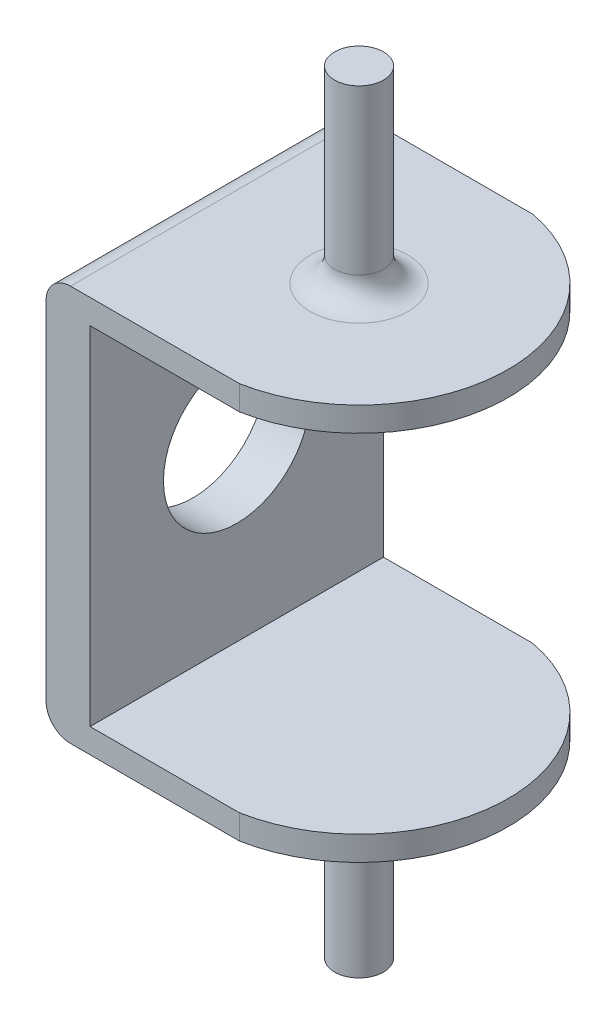
ISO-10303-21;
HEADER;
FILE_DESCRIPTION(('STEP AP214'),'2;1');
FILE_NAME('part.step','',(''),(''),'','','');
FILE_SCHEMA(('AUTOMOTIVE_DESIGN { 1 0 10303 214 1 1 1 1 }'));
ENDSEC;
DATA;
#1=APPLICATION_CONTEXT('core data for automotive mechanical design processes');
#2=APPLICATION_PROTOCOL_DEFINITION('international standard','automotive_design',2000,#1);
#3=PRODUCT_CONTEXT('',#1,'mechanical');
#4=PRODUCT('Part','Part','',(#3));
#5=PRODUCT_RELATED_PRODUCT_CATEGORY('part','',(#4));
#6=PRODUCT_DEFINITION_FORMATION('','',#4);
#7=PRODUCT_DEFINITION_CONTEXT('part definition',#1,'design');
#8=PRODUCT_DEFINITION('design','',#6,#7);
#9=PRODUCT_DEFINITION_SHAPE('','',#8);
#10=(LENGTH_UNIT() NAMED_UNIT(*) SI_UNIT(.MILLI.,.METRE.));
#11=(NAMED_UNIT(*) PLANE_ANGLE_UNIT() SI_UNIT($,.RADIAN.));
#12=(NAMED_UNIT(*) SI_UNIT($,.STERADIAN.) SOLID_ANGLE_UNIT());
#13=UNCERTAINTY_MEASURE_WITH_UNIT(LENGTH_MEASURE(1.E-05),#10,'distance_accuracy_value','');
#14=(GEOMETRIC_REPRESENTATION_CONTEXT(3) GLOBAL_UNCERTAINTY_ASSIGNED_CONTEXT((#13)) GLOBAL_UNIT_ASSIGNED_CONTEXT((#10,
#11,#12)) REPRESENTATION_CONTEXT('',''));
#15=CARTESIAN_POINT('',(0.,0.,0.));
#16=DIRECTION('',(0.,0.,1.));
#17=DIRECTION('',(1.,0.,0.));
#18=AXIS2_PLACEMENT_3D('',#15,#16,#17);
#19=CARTESIAN_POINT('',(11.0124386918829,70.05,-60.));
#20=DIRECTION('',(0.,0.,1.));
#21=DIRECTION('',(1.,0.,0.));
#22=AXIS2_PLACEMENT_3D('',#19,#20,#21);
#23=PLANE('',#22);
#24=DIRECTION('',(0.,1.,0.));
#25=VECTOR('',#24,1.);
#26=CARTESIAN_POINT('',(-68.,-81.95,-60.));
#27=LINE('',#26,#25);
#28=CARTESIAN_POINT('',(-68.,-71.95,-60.));
#29=VERTEX_POINT('',#28);
#30=CARTESIAN_POINT('',(-68.,70.05,-60.));
#31=VERTEX_POINT('',#30);
#32=EDGE_CURVE('E141',#29,#31,#27,.T.);
#33=ORIENTED_EDGE('',*,*,#32,.T.);
#34=CARTESIAN_POINT('',(-58.,70.05,-60.));
#35=DIRECTION('',(0.,0.,1.));
#36=DIRECTION('',(1.,0.,0.));
#37=AXIS2_PLACEMENT_3D('',#34,#35,#36);
#38=CIRCLE('',#37,10.);
#39=CARTESIAN_POINT('',(-58.,80.05,-60.));
#40=VERTEX_POINT('',#39);
#41=EDGE_CURVE('E202',#31,#40,#38,.F.);
#42=ORIENTED_EDGE('',*,*,#41,.T.);
#43=DIRECTION('',(1.,0.,0.));
#44=VECTOR('',#43,1.);
#45=CARTESIAN_POINT('',(11.0124386918829,80.05,-60.));
#46=LINE('',#45,#44);
#47=CARTESIAN_POINT('',(11.0124386918829,80.05,-60.));
#48=VERTEX_POINT('',#47);
#49=EDGE_CURVE('E172',#40,#48,#46,.T.);
#50=ORIENTED_EDGE('',*,*,#49,.T.);
#51=DIRECTION('',(0.,1.,0.));
#52=VECTOR('',#51,1.);
#53=CARTESIAN_POINT('',(11.0124386918829,70.05,-60.));
#54=LINE('',#53,#52);
#55=CARTESIAN_POINT('',(11.0124386918829,70.05,-60.));
#56=VERTEX_POINT('',#55);
#57=EDGE_CURVE('E186',#56,#48,#54,.T.);
#58=ORIENTED_EDGE('',*,*,#57,.F.);
#59=DIRECTION('',(1.,0.,0.));
#60=VECTOR('',#59,1.);
#61=CARTESIAN_POINT('',(-11.0124386918829,70.05,-60.));
#62=LINE('',#61,#60);
#63=CARTESIAN_POINT('',(-50.,70.05,-60.));
#64=VERTEX_POINT('',#63);
#65=EDGE_CURVE('E150',#64,#56,#62,.T.);
#66=ORIENTED_EDGE('',*,*,#65,.F.);
#67=DIRECTION('',(0.,-1.,0.));
#68=VECTOR('',#67,1.);
#69=CARTESIAN_POINT('',(-50.,-71.95,-60.));
#70=LINE('',#69,#68);
#71=CARTESIAN_POINT('',(-50.,-71.95,-60.));
#72=VERTEX_POINT('',#71);
#73=EDGE_CURVE('E133',#64,#72,#70,.T.);
#74=ORIENTED_EDGE('',*,*,#73,.T.);
#75=DIRECTION('',(1.,0.,0.));
#76=VECTOR('',#75,1.);
#77=CARTESIAN_POINT('',(11.0124386918829,-71.95,-60.));
#78=LINE('',#77,#76);
#79=CARTESIAN_POINT('',(11.0124386918829,-71.95,-60.));
#80=VERTEX_POINT('',#79);
#81=EDGE_CURVE('E147',#72,#80,#78,.T.);
#82=ORIENTED_EDGE('',*,*,#81,.T.);
#83=DIRECTION('',(0.,-1.,0.));
#84=VECTOR('',#83,1.);
#85=CARTESIAN_POINT('',(11.0124386918829,-71.95,-60.));
#86=LINE('',#85,#84);
#87=CARTESIAN_POINT('',(11.0124386918829,-81.95,-60.));
#88=VERTEX_POINT('',#87);
#89=EDGE_CURVE('E156',#80,#88,#86,.T.);
#90=ORIENTED_EDGE('',*,*,#89,.T.);
#91=DIRECTION('',(1.,0.,0.));
#92=VECTOR('',#91,1.);
#93=CARTESIAN_POINT('',(-11.0124386918829,-81.95,-60.));
#94=LINE('',#93,#92);
#95=CARTESIAN_POINT('',(-58.,-81.95,-60.));
#96=VERTEX_POINT('',#95);
#97=EDGE_CURVE('E169',#96,#88,#94,.T.);
#98=ORIENTED_EDGE('',*,*,#97,.F.);
#99=CARTESIAN_POINT('',(-58.,-71.95,-60.));
#100=DIRECTION('',(0.,0.,1.));
#101=DIRECTION('',(1.,0.,0.));
#102=AXIS2_PLACEMENT_3D('',#99,#100,#101);
#103=CIRCLE('',#102,10.);
#104=EDGE_CURVE('E200',#96,#29,#103,.F.);
#105=ORIENTED_EDGE('',*,*,#104,.T.);
#106=EDGE_LOOP('',(#33,#42,#50,#58,#66,#74,#82,#90,#98,#105));
#107=FACE_BOUND('',#106,.T.);
#108=ADVANCED_FACE('F48',(#107),#23,.F.);
#109=CARTESIAN_POINT('',(0.,70.05,0.));
#110=DIRECTION('',(0.,1.,0.));
#111=DIRECTION('',(0.,0.,1.));
#112=AXIS2_PLACEMENT_3D('',#109,#110,#111);
#113=CYLINDRICAL_SURFACE('',#112,61.0022442697191);
#114=CARTESIAN_POINT('',(0.,80.05,0.));
#115=DIRECTION('',(0.,-1.,0.));
#116=DIRECTION('',(0.,0.,1.));
#117=AXIS2_PLACEMENT_3D('',#114,#115,#116);
#118=CIRCLE('',#117,61.0022442697191);
#119=CARTESIAN_POINT('',(11.0124386918829,80.05,60.));
#120=VERTEX_POINT('',#119);
#121=EDGE_CURVE('E181',#48,#120,#118,.T.);
#122=ORIENTED_EDGE('',*,*,#121,.T.);
#123=DIRECTION('',(0.,1.,0.));
#124=VECTOR('',#123,1.);
#125=CARTESIAN_POINT('',(11.0124386918829,70.05,60.));
#126=LINE('',#125,#124);
#127=CARTESIAN_POINT('',(11.0124386918829,70.05,60.));
#128=VERTEX_POINT('',#127);
#129=EDGE_CURVE('E179',#128,#120,#126,.T.);
#130=ORIENTED_EDGE('',*,*,#129,.F.);
#131=CARTESIAN_POINT('',(0.,70.05,0.));
#132=DIRECTION('',(0.,-1.,0.));
#133=DIRECTION('',(0.,0.,1.));
#134=AXIS2_PLACEMENT_3D('',#131,#132,#133);
#135=CIRCLE('',#134,61.0022442697191);
#136=EDGE_CURVE('E177',#56,#128,#135,.T.);
#137=ORIENTED_EDGE('',*,*,#136,.F.);
#138=ORIENTED_EDGE('',*,*,#57,.T.);
#139=EDGE_LOOP('',(#122,#130,#137,#138));
#140=FACE_BOUND('',#139,.T.);
#141=ADVANCED_FACE('F265',(#140),#113,.T.);
#142=CARTESIAN_POINT('',(11.0124386918829,70.05,60.));
#143=DIRECTION('',(0.,0.,-1.));
#144=DIRECTION('',(-1.,0.,0.));
#145=AXIS2_PLACEMENT_3D('',#142,#143,#144);
#146=PLANE('',#145);
#147=DIRECTION('',(-1.,0.,0.));
#148=VECTOR('',#147,1.);
#149=CARTESIAN_POINT('',(11.0124386918829,80.05,60.));
#150=LINE('',#149,#148);
#151=CARTESIAN_POINT('',(-58.,80.05,60.));
#152=VERTEX_POINT('',#151);
#153=EDGE_CURVE('E175',#120,#152,#150,.T.);
#154=ORIENTED_EDGE('',*,*,#153,.T.);
#155=CARTESIAN_POINT('',(-58.,70.05,60.));
#156=DIRECTION('',(0.,0.,-1.));
#157=DIRECTION('',(-1.,0.,0.));
#158=AXIS2_PLACEMENT_3D('',#155,#156,#157);
#159=CIRCLE('',#158,10.);
#160=CARTESIAN_POINT('',(-68.,70.05,60.));
#161=VERTEX_POINT('',#160);
#162=EDGE_CURVE('E209',#152,#161,#159,.F.);
#163=ORIENTED_EDGE('',*,*,#162,.T.);
#164=DIRECTION('',(0.,-1.,0.));
#165=VECTOR('',#164,1.);
#166=CARTESIAN_POINT('',(-68.,-81.95,60.));
#167=LINE('',#166,#165);
#168=CARTESIAN_POINT('',(-68.,-71.95,60.));
#169=VERTEX_POINT('',#168);
#170=EDGE_CURVE('E247',#161,#169,#167,.T.);
#171=ORIENTED_EDGE('',*,*,#170,.T.);
#172=CARTESIAN_POINT('',(-58.,-71.95,60.));
#173=DIRECTION('',(0.,0.,-1.));
#174=DIRECTION('',(-1.,0.,0.));
#175=AXIS2_PLACEMENT_3D('',#172,#173,#174);
#176=CIRCLE('',#175,10.);
#177=CARTESIAN_POINT('',(-58.,-81.95,60.));
#178=VERTEX_POINT('',#177);
#179=EDGE_CURVE('E63',#169,#178,#176,.F.);
#180=ORIENTED_EDGE('',*,*,#179,.T.);
#181=DIRECTION('',(-1.,0.,0.));
#182=VECTOR('',#181,1.);
#183=CARTESIAN_POINT('',(11.0124386918829,-81.95,60.));
#184=LINE('',#183,#182);
#185=CARTESIAN_POINT('',(11.0124386918829,-81.95,60.));
#186=VERTEX_POINT('',#185);
#187=EDGE_CURVE('E164',#186,#178,#184,.T.);
#188=ORIENTED_EDGE('',*,*,#187,.F.);
#189=DIRECTION('',(0.,-1.,0.));
#190=VECTOR('',#189,1.);
#191=CARTESIAN_POINT('',(11.0124386918829,-71.95,60.));
#192=LINE('',#191,#190);
#193=CARTESIAN_POINT('',(11.0124386918829,-71.95,60.));
#194=VERTEX_POINT('',#193);
#195=EDGE_CURVE('E158',#194,#186,#192,.T.);
#196=ORIENTED_EDGE('',*,*,#195,.F.);
#197=DIRECTION('',(-1.,0.,0.));
#198=VECTOR('',#197,1.);
#199=CARTESIAN_POINT('',(-11.0124386918829,-71.95,60.));
#200=LINE('',#199,#198);
#201=CARTESIAN_POINT('',(-50.,-71.95,60.));
#202=VERTEX_POINT('',#201);
#203=EDGE_CURVE('E160',#194,#202,#200,.T.);
#204=ORIENTED_EDGE('',*,*,#203,.T.);
#205=DIRECTION('',(0.,1.,0.));
#206=VECTOR('',#205,1.);
#207=CARTESIAN_POINT('',(-50.,-71.95,60.));
#208=LINE('',#207,#206);
#209=CARTESIAN_POINT('',(-50.,70.05,60.));
#210=VERTEX_POINT('',#209);
#211=EDGE_CURVE('E135',#202,#210,#208,.T.);
#212=ORIENTED_EDGE('',*,*,#211,.T.);
#213=DIRECTION('',(-1.,0.,0.));
#214=VECTOR('',#213,1.);
#215=CARTESIAN_POINT('',(-11.0124386918829,70.05,60.));
#216=LINE('',#215,#214);
#217=EDGE_CURVE('E173',#128,#210,#216,.T.);
#218=ORIENTED_EDGE('',*,*,#217,.F.);
#219=ORIENTED_EDGE('',*,*,#129,.T.);
#220=EDGE_LOOP('',(#154,#163,#171,#180,#188,#196,#204,#212,#218,#219));
#221=FACE_BOUND('',#220,.T.);
#222=ADVANCED_FACE('F248',(#221),#146,.F.);
#223=CARTESIAN_POINT('',(0.,70.05,0.));
#224=DIRECTION('',(0.,1.,0.));
#225=DIRECTION('',(0.,0.,1.));
#226=AXIS2_PLACEMENT_3D('',#223,#224,#225);
#227=PLANE('',#226);
#228=ORIENTED_EDGE('',*,*,#217,.T.);
#229=DIRECTION('',(0.,0.,-1.));
#230=VECTOR('',#229,1.);
#231=CARTESIAN_POINT('',(-50.0000000000001,70.05,222.996932486473));
#232=LINE('',#231,#230);
#233=EDGE_CURVE('E140',#210,#64,#232,.T.);
#234=ORIENTED_EDGE('',*,*,#233,.T.);
#235=ORIENTED_EDGE('',*,*,#65,.T.);
#236=ORIENTED_EDGE('',*,*,#136,.T.);
#237=EDGE_LOOP('',(#228,#234,#235,#236));
#238=FACE_BOUND('',#237,.T.);
#239=ADVANCED_FACE('F335',(#238),#227,.F.);
#240=CARTESIAN_POINT('',(0.,80.05,0.));
#241=DIRECTION('',(0.,1.,0.));
#242=DIRECTION('',(0.,0.,1.));
#243=AXIS2_PLACEMENT_3D('',#240,#241,#242);
#244=PLANE('',#243);
#245=CARTESIAN_POINT('',(0.,80.05,0.));
#246=DIRECTION('',(0.,1.,0.));
#247=DIRECTION('',(0.,0.,1.));
#248=AXIS2_PLACEMENT_3D('',#245,#246,#247);
#249=CIRCLE('',#248,20.);
#250=CARTESIAN_POINT('',(0.,80.05,20.));
#251=VERTEX_POINT('',#250);
#252=EDGE_CURVE('E204',#251,#251,#249,.F.);
#253=ORIENTED_EDGE('',*,*,#252,.T.);
#254=EDGE_LOOP('',(#253));
#255=FACE_BOUND('',#254,.T.);
#256=ORIENTED_EDGE('',*,*,#49,.F.);
#257=DIRECTION('',(0.,0.,-1.));
#258=VECTOR('',#257,1.);
#259=CARTESIAN_POINT('',(-58.,80.05,0.));
#260=LINE('',#259,#258);
#261=EDGE_CURVE('E71',#40,#152,#260,.F.);
#262=ORIENTED_EDGE('',*,*,#261,.T.);
#263=ORIENTED_EDGE('',*,*,#153,.F.);
#264=ORIENTED_EDGE('',*,*,#121,.F.);
#265=EDGE_LOOP('',(#256,#262,#263,#264));
#266=FACE_BOUND('',#265,.T.);
#267=ADVANCED_FACE('F275',(#255,#266),#244,.T.);
#268=CARTESIAN_POINT('',(0.,157.03373393,0.));
#269=DIRECTION('',(0.,1.,0.));
#270=DIRECTION('',(0.,0.,1.));
#271=AXIS2_PLACEMENT_3D('',#268,#269,#270);
#272=PLANE('',#271);
#273=CARTESIAN_POINT('',(0.,157.03373393,0.));
#274=DIRECTION('',(0.,1.,0.));
#275=DIRECTION('',(0.,0.,1.));
#276=AXIS2_PLACEMENT_3D('',#273,#274,#275);
#277=CIRCLE('',#276,10.);
#278=CARTESIAN_POINT('',(0.,157.03373393,10.));
#279=VERTEX_POINT('',#278);
#280=EDGE_CURVE('E189',#279,#279,#277,.T.);
#281=ORIENTED_EDGE('',*,*,#280,.T.);
#282=EDGE_LOOP('',(#281));
#283=FACE_BOUND('',#282,.T.);
#284=ADVANCED_FACE('F260',(#283),#272,.T.);
#285=CARTESIAN_POINT('',(0.,158.93373393,0.));
#286=DIRECTION('',(0.,-1.,0.));
#287=DIRECTION('',(0.,0.,-1.));
#288=AXIS2_PLACEMENT_3D('',#285,#286,#287);
#289=CYLINDRICAL_SURFACE('',#288,10.);
#290=CARTESIAN_POINT('',(0.,90.05,0.));
#291=DIRECTION('',(0.,1.,0.));
#292=DIRECTION('',(0.,0.,1.));
#293=AXIS2_PLACEMENT_3D('',#290,#291,#292);
#294=CIRCLE('',#293,10.);
#295=CARTESIAN_POINT('',(0.,90.05,9.99999999999997));
#296=VERTEX_POINT('',#295);
#297=EDGE_CURVE('E12',#296,#296,#294,.T.);
#298=ORIENTED_EDGE('',*,*,#297,.T.);
#299=EDGE_LOOP('',(#298));
#300=FACE_BOUND('',#299,.T.);
#301=ORIENTED_EDGE('',*,*,#280,.F.);
#302=EDGE_LOOP('',(#301));
#303=FACE_BOUND('',#302,.T.);
#304=ADVANCED_FACE('F253',(#300,#303),#289,.T.);
#305=CARTESIAN_POINT('',(0.,-71.95,0.));
#306=DIRECTION('',(0.,-1.,0.));
#307=DIRECTION('',(0.,0.,-1.));
#308=AXIS2_PLACEMENT_3D('',#305,#306,#307);
#309=CYLINDRICAL_SURFACE('',#308,61.0022442697191);
#310=CARTESIAN_POINT('',(0.,-81.95,0.));
#311=DIRECTION('',(0.,-1.,0.));
#312=DIRECTION('',(0.,0.,1.));
#313=AXIS2_PLACEMENT_3D('',#310,#311,#312);
#314=CIRCLE('',#313,61.0022442697191);
#315=EDGE_CURVE('E166',#88,#186,#314,.T.);
#316=ORIENTED_EDGE('',*,*,#315,.F.);
#317=ORIENTED_EDGE('',*,*,#89,.F.);
#318=CARTESIAN_POINT('',(0.,-71.95,0.));
#319=DIRECTION('',(0.,-1.,0.));
#320=DIRECTION('',(0.,0.,1.));
#321=AXIS2_PLACEMENT_3D('',#318,#319,#320);
#322=CIRCLE('',#321,61.0022442697191);
#323=EDGE_CURVE('E155',#80,#194,#322,.T.);
#324=ORIENTED_EDGE('',*,*,#323,.T.);
#325=ORIENTED_EDGE('',*,*,#195,.T.);
#326=EDGE_LOOP('',(#316,#317,#324,#325));
#327=FACE_BOUND('',#326,.T.);
#328=ADVANCED_FACE('F251',(#327),#309,.T.);
#329=CARTESIAN_POINT('',(0.,-71.95,0.));
#330=DIRECTION('',(0.,-1.,0.));
#331=DIRECTION('',(0.,0.,1.));
#332=AXIS2_PLACEMENT_3D('',#329,#330,#331);
#333=PLANE('',#332);
#334=ORIENTED_EDGE('',*,*,#81,.F.);
#335=DIRECTION('',(0.,0.,-1.));
#336=VECTOR('',#335,1.);
#337=CARTESIAN_POINT('',(-50.0000000000001,-71.95,222.996932486473));
#338=LINE('',#337,#336);
#339=EDGE_CURVE('E129',#202,#72,#338,.T.);
#340=ORIENTED_EDGE('',*,*,#339,.F.);
#341=ORIENTED_EDGE('',*,*,#203,.F.);
#342=ORIENTED_EDGE('',*,*,#323,.F.);
#343=EDGE_LOOP('',(#334,#340,#341,#342));
#344=FACE_BOUND('',#343,.T.);
#345=ADVANCED_FACE('F154',(#344),#333,.F.);
#346=CARTESIAN_POINT('',(0.,-81.95,0.));
#347=DIRECTION('',(0.,-1.,0.));
#348=DIRECTION('',(0.,0.,1.));
#349=AXIS2_PLACEMENT_3D('',#346,#347,#348);
#350=PLANE('',#349);
#351=CARTESIAN_POINT('',(0.,-81.95,0.));
#352=DIRECTION('',(0.,-1.,0.));
#353=DIRECTION('',(0.,0.,-1.));
#354=AXIS2_PLACEMENT_3D('',#351,#352,#353);
#355=CIRCLE('',#354,20.);
#356=CARTESIAN_POINT('',(0.,-81.95,-20.));
#357=VERTEX_POINT('',#356);
#358=EDGE_CURVE('E211',#357,#357,#355,.F.);
#359=ORIENTED_EDGE('',*,*,#358,.T.);
#360=EDGE_LOOP('',(#359));
#361=FACE_BOUND('',#360,.T.);
#362=ORIENTED_EDGE('',*,*,#187,.T.);
#363=DIRECTION('',(0.,0.,-1.));
#364=VECTOR('',#363,1.);
#365=CARTESIAN_POINT('',(-58.,-81.95,0.));
#366=LINE('',#365,#364);
#367=EDGE_CURVE('E214',#178,#96,#366,.T.);
#368=ORIENTED_EDGE('',*,*,#367,.T.);
#369=ORIENTED_EDGE('',*,*,#97,.T.);
#370=ORIENTED_EDGE('',*,*,#315,.T.);
#371=EDGE_LOOP('',(#362,#368,#369,#370));
#372=FACE_BOUND('',#371,.T.);
#373=ADVANCED_FACE('F228',(#361,#372),#350,.T.);
#374=CARTESIAN_POINT('',(0.,-158.93373393,0.));
#375=DIRECTION('',(0.,-1.,0.));
#376=DIRECTION('',(0.,0.,-1.));
#377=AXIS2_PLACEMENT_3D('',#374,#375,#376);
#378=PLANE('',#377);
#379=CARTESIAN_POINT('',(0.,-158.93373393,0.));
#380=DIRECTION('',(0.,-1.,0.));
#381=DIRECTION('',(0.,0.,-1.));
#382=AXIS2_PLACEMENT_3D('',#379,#380,#381);
#383=CIRCLE('',#382,10.);
#384=CARTESIAN_POINT('',(0.,-158.93373393,-10.));
#385=VERTEX_POINT('',#384);
#386=EDGE_CURVE('E192',#385,#385,#383,.T.);
#387=ORIENTED_EDGE('',*,*,#386,.T.);
#388=EDGE_LOOP('',(#387));
#389=FACE_BOUND('',#388,.T.);
#390=ADVANCED_FACE('F231',(#389),#378,.T.);
#391=CARTESIAN_POINT('',(0.,-91.95,0.));
#392=DIRECTION('',(0.,-1.,0.));
#393=DIRECTION('',(0.,0.,-1.));
#394=AXIS2_PLACEMENT_3D('',#391,#392,#393);
#395=CIRCLE('',#394,10.);
#396=CARTESIAN_POINT('',(0.,-91.95,-10.));
#397=VERTEX_POINT('',#396);
#398=EDGE_CURVE('E56',#397,#397,#395,.T.);
#399=ORIENTED_EDGE('',*,*,#398,.T.);
#400=EDGE_LOOP('',(#399));
#401=FACE_BOUND('',#400,.T.);
#402=ORIENTED_EDGE('',*,*,#386,.F.);
#403=EDGE_LOOP('',(#402));
#404=FACE_BOUND('',#403,.T.);
#405=ADVANCED_FACE('F219',(#401,#404),#289,.T.);
#406=CARTESIAN_POINT('',(-50.0000000000001,-71.95,222.996932486473));
#407=DIRECTION('',(1.,0.,0.));
#408=DIRECTION('',(0.,0.,-1.));
#409=AXIS2_PLACEMENT_3D('',#406,#407,#408);
#410=PLANE('',#409);
#411=CARTESIAN_POINT('',(-50.,0.,0.));
#412=DIRECTION('',(1.,0.,0.));
#413=DIRECTION('',(0.,0.,-1.));
#414=AXIS2_PLACEMENT_3D('',#411,#412,#413);
#415=CIRCLE('',#414,30.);
#416=CARTESIAN_POINT('',(-50.,0.,-30.));
#417=VERTEX_POINT('',#416);
#418=EDGE_CURVE('E151',#417,#417,#415,.F.);
#419=ORIENTED_EDGE('',*,*,#418,.T.);
#420=EDGE_LOOP('',(#419));
#421=FACE_BOUND('',#420,.T.);
#422=ORIENTED_EDGE('',*,*,#211,.F.);
#423=ORIENTED_EDGE('',*,*,#339,.T.);
#424=ORIENTED_EDGE('',*,*,#73,.F.);
#425=ORIENTED_EDGE('',*,*,#233,.F.);
#426=EDGE_LOOP('',(#422,#423,#424,#425));
#427=FACE_BOUND('',#426,.T.);
#428=ADVANCED_FACE('F131',(#421,#427),#410,.T.);
#429=CARTESIAN_POINT('',(-68.0000000000001,-81.95,222.996932486473));
#430=DIRECTION('',(-1.,0.,0.));
#431=DIRECTION('',(0.,0.,1.));
#432=AXIS2_PLACEMENT_3D('',#429,#430,#431);
#433=PLANE('',#432);
#434=CARTESIAN_POINT('',(-68.,0.,0.));
#435=DIRECTION('',(-1.,0.,0.));
#436=DIRECTION('',(0.,0.,1.));
#437=AXIS2_PLACEMENT_3D('',#434,#435,#436);
#438=CIRCLE('',#437,30.);
#439=CARTESIAN_POINT('',(-68.,0.,30.));
#440=VERTEX_POINT('',#439);
#441=EDGE_CURVE('E481',#440,#440,#438,.T.);
#442=ORIENTED_EDGE('',*,*,#441,.F.);
#443=EDGE_LOOP('',(#442));
#444=FACE_BOUND('',#443,.T.);
#445=ORIENTED_EDGE('',*,*,#170,.F.);
#446=DIRECTION('',(0.,0.,-1.));
#447=VECTOR('',#446,1.);
#448=CARTESIAN_POINT('',(-68.0000000000001,70.05,222.996932486473));
#449=LINE('',#448,#447);
#450=EDGE_CURVE('E197',#161,#31,#449,.T.);
#451=ORIENTED_EDGE('',*,*,#450,.T.);
#452=ORIENTED_EDGE('',*,*,#32,.F.);
#453=DIRECTION('',(0.,0.,-1.));
#454=VECTOR('',#453,1.);
#455=CARTESIAN_POINT('',(-68.0000000000001,-71.95,222.996932486473));
#456=LINE('',#455,#454);
#457=EDGE_CURVE('E195',#29,#169,#456,.F.);
#458=ORIENTED_EDGE('',*,*,#457,.T.);
#459=EDGE_LOOP('',(#445,#451,#452,#458));
#460=FACE_BOUND('',#459,.T.);
#461=ADVANCED_FACE('F242',(#444,#460),#433,.T.);
#462=CARTESIAN_POINT('',(34.8528137423857,0.,0.));
#463=DIRECTION('',(-1.,0.,0.));
#464=DIRECTION('',(0.,0.,1.));
#465=AXIS2_PLACEMENT_3D('',#462,#463,#464);
#466=CYLINDRICAL_SURFACE('',#465,30.);
#467=ORIENTED_EDGE('',*,*,#441,.T.);
#468=EDGE_LOOP('',(#467));
#469=FACE_BOUND('',#468,.T.);
#470=ORIENTED_EDGE('',*,*,#418,.F.);
#471=EDGE_LOOP('',(#470));
#472=FACE_BOUND('',#471,.T.);
#473=ADVANCED_FACE('F284',(#469,#472),#466,.F.);
#474=CARTESIAN_POINT('',(-58.0000000000001,70.05,222.996932486473));
#475=DIRECTION('',(0.,0.,-1.));
#476=DIRECTION('',(-1.,0.,0.));
#477=AXIS2_PLACEMENT_3D('',#474,#475,#476);
#478=CYLINDRICAL_SURFACE('',#477,10.);
#479=ORIENTED_EDGE('',*,*,#162,.F.);
#480=ORIENTED_EDGE('',*,*,#261,.F.);
#481=ORIENTED_EDGE('',*,*,#41,.F.);
#482=ORIENTED_EDGE('',*,*,#450,.F.);
#483=EDGE_LOOP('',(#479,#480,#481,#482));
#484=FACE_BOUND('',#483,.T.);
#485=ADVANCED_FACE('F281',(#484),#478,.T.);
#486=CARTESIAN_POINT('',(-58.,-71.95,0.));
#487=DIRECTION('',(0.,0.,-1.));
#488=DIRECTION('',(-1.,0.,0.));
#489=AXIS2_PLACEMENT_3D('',#486,#487,#488);
#490=CYLINDRICAL_SURFACE('',#489,10.);
#491=ORIENTED_EDGE('',*,*,#179,.F.);
#492=ORIENTED_EDGE('',*,*,#457,.F.);
#493=ORIENTED_EDGE('',*,*,#104,.F.);
#494=ORIENTED_EDGE('',*,*,#367,.F.);
#495=EDGE_LOOP('',(#491,#492,#493,#494));
#496=FACE_BOUND('',#495,.T.);
#497=ADVANCED_FACE('F225',(#496),#490,.T.);
#498=CARTESIAN_POINT('',(0.,-91.95,0.));
#499=DIRECTION('',(0.,-1.,0.));
#500=DIRECTION('',(0.,0.,-1.));
#501=AXIS2_PLACEMENT_3D('',#498,#499,#500);
#502=TOROIDAL_SURFACE('',#501,20.,10.);
#503=ORIENTED_EDGE('',*,*,#398,.F.);
#504=EDGE_LOOP('',(#503));
#505=FACE_BOUND('',#504,.T.);
#506=ORIENTED_EDGE('',*,*,#358,.F.);
#507=EDGE_LOOP('',(#506));
#508=FACE_BOUND('',#507,.T.);
#509=ADVANCED_FACE('F222',(#505,#508),#502,.F.);
#510=CARTESIAN_POINT('',(0.,90.05,0.));
#511=DIRECTION('',(0.,1.,0.));
#512=DIRECTION('',(0.,0.,1.));
#513=AXIS2_PLACEMENT_3D('',#510,#511,#512);
#514=TOROIDAL_SURFACE('',#513,20.,10.);
#515=ORIENTED_EDGE('',*,*,#297,.F.);
#516=EDGE_LOOP('',(#515));
#517=FACE_BOUND('',#516,.T.);
#518=ORIENTED_EDGE('',*,*,#252,.F.);
#519=EDGE_LOOP('',(#518));
#520=FACE_BOUND('',#519,.T.);
#521=ADVANCED_FACE('F50',(#517,#520),#514,.F.);
#522=CLOSED_SHELL('',(#108,#141,#222,#239,#267,#284,#304,#328,#345,#373,#390,#405,#428,#461,
#473,#485,#497,#509,#521));
#523=MANIFOLD_SOLID_BREP('B2',#522);
#524=ADVANCED_BREP_SHAPE_REPRESENTATION('',(#18,#523),#14);
#525=SHAPE_DEFINITION_REPRESENTATION(#9,#524);
ENDSEC;
END-ISO-10303-21;
